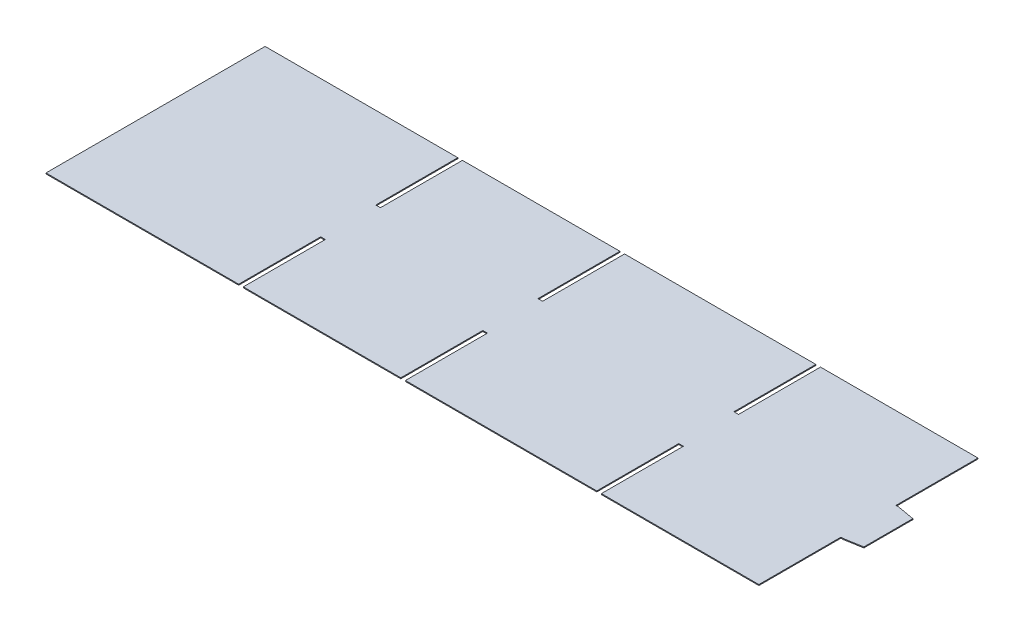
ISO-10303-21;
HEADER;
FILE_DESCRIPTION(('STEP AP214'),'2;1');
FILE_NAME('part.step','',(''),(''),'','','');
FILE_SCHEMA(('AUTOMOTIVE_DESIGN { 1 0 10303 214 1 1 1 1 }'));
ENDSEC;
DATA;
#1=APPLICATION_CONTEXT('core data for automotive mechanical design processes');
#2=APPLICATION_PROTOCOL_DEFINITION('international standard','automotive_design',2000,#1);
#3=PRODUCT_CONTEXT('',#1,'mechanical');
#4=PRODUCT('Part','Part','',(#3));
#5=PRODUCT_RELATED_PRODUCT_CATEGORY('part','',(#4));
#6=PRODUCT_DEFINITION_FORMATION('','',#4);
#7=PRODUCT_DEFINITION_CONTEXT('part definition',#1,'design');
#8=PRODUCT_DEFINITION('design','',#6,#7);
#9=PRODUCT_DEFINITION_SHAPE('','',#8);
#10=(LENGTH_UNIT() NAMED_UNIT(*) SI_UNIT(.MILLI.,.METRE.));
#11=(NAMED_UNIT(*) PLANE_ANGLE_UNIT() SI_UNIT($,.RADIAN.));
#12=(NAMED_UNIT(*) SI_UNIT($,.STERADIAN.) SOLID_ANGLE_UNIT());
#13=UNCERTAINTY_MEASURE_WITH_UNIT(LENGTH_MEASURE(1.E-05),#10,'distance_accuracy_value','');
#14=(GEOMETRIC_REPRESENTATION_CONTEXT(3) GLOBAL_UNCERTAINTY_ASSIGNED_CONTEXT((#13)) GLOBAL_UNIT_ASSIGNED_CONTEXT((#10,
#11,#12)) REPRESENTATION_CONTEXT('',''));
#15=CARTESIAN_POINT('',(0.,0.,0.));
#16=DIRECTION('',(0.,0.,1.));
#17=DIRECTION('',(1.,0.,0.));
#18=AXIS2_PLACEMENT_3D('',#15,#16,#17);
#19=CARTESIAN_POINT('',(0.,2.,177.));
#20=DIRECTION('',(0.,0.,-1.));
#21=DIRECTION('',(-1.,0.,0.));
#22=AXIS2_PLACEMENT_3D('',#19,#20,#21);
#23=PLANE('',#22);
#24=DIRECTION('',(1.,0.,0.));
#25=VECTOR('',#24,1.);
#26=CARTESIAN_POINT('',(0.,0.,177.));
#27=LINE('',#26,#25);
#28=CARTESIAN_POINT('',(0.,0.,177.));
#29=VERTEX_POINT('',#28);
#30=CARTESIAN_POINT('',(416.,0.,177.));
#31=VERTEX_POINT('',#30);
#32=EDGE_CURVE('E290',#29,#31,#27,.T.);
#33=ORIENTED_EDGE('',*,*,#32,.T.);
#34=DIRECTION('',(0.,-1.,0.));
#35=VECTOR('',#34,1.);
#36=CARTESIAN_POINT('',(416.,2.,177.));
#37=LINE('',#36,#35);
#38=CARTESIAN_POINT('',(416.,2.,177.));
#39=VERTEX_POINT('',#38);
#40=EDGE_CURVE('E42',#39,#31,#37,.T.);
#41=ORIENTED_EDGE('',*,*,#40,.F.);
#42=DIRECTION('',(1.,0.,0.));
#43=VECTOR('',#42,1.);
#44=CARTESIAN_POINT('',(0.,2.,177.));
#45=LINE('',#44,#43);
#46=CARTESIAN_POINT('',(0.,2.,177.));
#47=VERTEX_POINT('',#46);
#48=EDGE_CURVE('E172',#47,#39,#45,.T.);
#49=ORIENTED_EDGE('',*,*,#48,.F.);
#50=DIRECTION('',(0.,-1.,0.));
#51=VECTOR('',#50,1.);
#52=CARTESIAN_POINT('',(0.,2.,177.));
#53=LINE('',#52,#51);
#54=EDGE_CURVE('E11',#47,#29,#53,.T.);
#55=ORIENTED_EDGE('',*,*,#54,.T.);
#56=EDGE_LOOP('',(#33,#41,#49,#55));
#57=FACE_BOUND('',#56,.T.);
#58=ADVANCED_FACE('F34',(#57),#23,.F.);
#59=CARTESIAN_POINT('',(416.,2.,177.));
#60=DIRECTION('',(-1.,0.,0.));
#61=DIRECTION('',(0.,0.,1.));
#62=AXIS2_PLACEMENT_3D('',#59,#60,#61);
#63=PLANE('',#62);
#64=DIRECTION('',(0.,0.,-1.));
#65=VECTOR('',#64,1.);
#66=CARTESIAN_POINT('',(416.,0.,177.));
#67=LINE('',#66,#65);
#68=CARTESIAN_POINT('',(416.,0.,1.26124737069477E-13));
#69=VERTEX_POINT('',#68);
#70=EDGE_CURVE('E292',#31,#69,#67,.T.);
#71=ORIENTED_EDGE('',*,*,#70,.T.);
#72=DIRECTION('',(0.,-1.,0.));
#73=VECTOR('',#72,1.);
#74=CARTESIAN_POINT('',(416.,2.,1.26124737069477E-13));
#75=LINE('',#74,#73);
#76=CARTESIAN_POINT('',(416.,2.,1.26124737069477E-13));
#77=VERTEX_POINT('',#76);
#78=EDGE_CURVE('E439',#77,#69,#75,.T.);
#79=ORIENTED_EDGE('',*,*,#78,.F.);
#80=DIRECTION('',(0.,0.,-1.));
#81=VECTOR('',#80,1.);
#82=CARTESIAN_POINT('',(416.,2.,177.));
#83=LINE('',#82,#81);
#84=EDGE_CURVE('E447',#39,#77,#83,.T.);
#85=ORIENTED_EDGE('',*,*,#84,.F.);
#86=ORIENTED_EDGE('',*,*,#40,.T.);
#87=EDGE_LOOP('',(#71,#79,#85,#86));
#88=FACE_BOUND('',#87,.T.);
#89=ADVANCED_FACE('F445',(#88),#63,.F.);
#90=CARTESIAN_POINT('',(416.,2.,1.26124737069477E-13));
#91=DIRECTION('',(0.,0.,-1.));
#92=DIRECTION('',(-1.,0.,0.));
#93=AXIS2_PLACEMENT_3D('',#90,#91,#92);
#94=PLANE('',#93);
#95=DIRECTION('',(1.,0.,0.));
#96=VECTOR('',#95,1.);
#97=CARTESIAN_POINT('',(416.,0.,1.26124737069477E-13));
#98=LINE('',#97,#96);
#99=CARTESIAN_POINT('',(426.,0.,1.2490009027033E-13));
#100=VERTEX_POINT('',#99);
#101=EDGE_CURVE('E294',#69,#100,#98,.T.);
#102=ORIENTED_EDGE('',*,*,#101,.T.);
#103=DIRECTION('',(0.,-1.,0.));
#104=VECTOR('',#103,1.);
#105=CARTESIAN_POINT('',(426.,2.,1.2490009027033E-13));
#106=LINE('',#105,#104);
#107=CARTESIAN_POINT('',(426.,2.,1.2490009027033E-13));
#108=VERTEX_POINT('',#107);
#109=EDGE_CURVE('E436',#108,#100,#106,.T.);
#110=ORIENTED_EDGE('',*,*,#109,.F.);
#111=DIRECTION('',(1.,0.,0.));
#112=VECTOR('',#111,1.);
#113=CARTESIAN_POINT('',(416.,2.,1.26124737069477E-13));
#114=LINE('',#113,#112);
#115=EDGE_CURVE('E466',#77,#108,#114,.T.);
#116=ORIENTED_EDGE('',*,*,#115,.F.);
#117=ORIENTED_EDGE('',*,*,#78,.T.);
#118=EDGE_LOOP('',(#102,#110,#116,#117));
#119=FACE_BOUND('',#118,.T.);
#120=ADVANCED_FACE('F457',(#119),#94,.F.);
#121=CARTESIAN_POINT('',(426.,2.,1.2490009027033E-13));
#122=DIRECTION('',(1.,0.,0.));
#123=DIRECTION('',(0.,0.,-1.));
#124=AXIS2_PLACEMENT_3D('',#121,#122,#123);
#125=PLANE('',#124);
#126=DIRECTION('',(0.,0.,1.));
#127=VECTOR('',#126,1.);
#128=CARTESIAN_POINT('',(426.,0.,1.2490009027033E-13));
#129=LINE('',#128,#127);
#130=CARTESIAN_POINT('',(426.,0.,177.));
#131=VERTEX_POINT('',#130);
#132=EDGE_CURVE('E296',#100,#131,#129,.T.);
#133=ORIENTED_EDGE('',*,*,#132,.T.);
#134=DIRECTION('',(0.,-1.,0.));
#135=VECTOR('',#134,1.);
#136=CARTESIAN_POINT('',(426.,2.,177.));
#137=LINE('',#136,#135);
#138=CARTESIAN_POINT('',(426.,2.,177.));
#139=VERTEX_POINT('',#138);
#140=EDGE_CURVE('E433',#139,#131,#137,.T.);
#141=ORIENTED_EDGE('',*,*,#140,.F.);
#142=DIRECTION('',(0.,0.,1.));
#143=VECTOR('',#142,1.);
#144=CARTESIAN_POINT('',(426.,2.,1.2490009027033E-13));
#145=LINE('',#144,#143);
#146=EDGE_CURVE('E463',#108,#139,#145,.T.);
#147=ORIENTED_EDGE('',*,*,#146,.F.);
#148=ORIENTED_EDGE('',*,*,#109,.T.);
#149=EDGE_LOOP('',(#133,#141,#147,#148));
#150=FACE_BOUND('',#149,.T.);
#151=ADVANCED_FACE('F461',(#150),#125,.F.);
#152=CARTESIAN_POINT('',(426.,2.,177.));
#153=DIRECTION('',(0.,0.,-1.));
#154=DIRECTION('',(-1.,0.,0.));
#155=AXIS2_PLACEMENT_3D('',#152,#153,#154);
#156=PLANE('',#155);
#157=DIRECTION('',(1.,0.,0.));
#158=VECTOR('',#157,1.);
#159=CARTESIAN_POINT('',(426.,0.,177.));
#160=LINE('',#159,#158);
#161=CARTESIAN_POINT('',(766.,0.,177.));
#162=VERTEX_POINT('',#161);
#163=EDGE_CURVE('E298',#131,#162,#160,.T.);
#164=ORIENTED_EDGE('',*,*,#163,.T.);
#165=DIRECTION('',(0.,-1.,0.));
#166=VECTOR('',#165,1.);
#167=CARTESIAN_POINT('',(766.,2.,177.));
#168=LINE('',#167,#166);
#169=CARTESIAN_POINT('',(766.,2.,177.));
#170=VERTEX_POINT('',#169);
#171=EDGE_CURVE('E430',#170,#162,#168,.T.);
#172=ORIENTED_EDGE('',*,*,#171,.F.);
#173=DIRECTION('',(1.,0.,0.));
#174=VECTOR('',#173,1.);
#175=CARTESIAN_POINT('',(426.,2.,177.));
#176=LINE('',#175,#174);
#177=EDGE_CURVE('E465',#139,#170,#176,.T.);
#178=ORIENTED_EDGE('',*,*,#177,.F.);
#179=ORIENTED_EDGE('',*,*,#140,.T.);
#180=EDGE_LOOP('',(#164,#172,#178,#179));
#181=FACE_BOUND('',#180,.T.);
#182=ADVANCED_FACE('F552',(#181),#156,.F.);
#183=CARTESIAN_POINT('',(766.,2.,177.));
#184=DIRECTION('',(-1.,0.,0.));
#185=DIRECTION('',(0.,0.,1.));
#186=AXIS2_PLACEMENT_3D('',#183,#184,#185);
#187=PLANE('',#186);
#188=DIRECTION('',(0.,0.,-1.));
#189=VECTOR('',#188,1.);
#190=CARTESIAN_POINT('',(766.,0.,177.));
#191=LINE('',#190,#189);
#192=CARTESIAN_POINT('',(766.,0.,0.));
#193=VERTEX_POINT('',#192);
#194=EDGE_CURVE('E300',#162,#193,#191,.T.);
#195=ORIENTED_EDGE('',*,*,#194,.T.);
#196=DIRECTION('',(0.,-1.,0.));
#197=VECTOR('',#196,1.);
#198=CARTESIAN_POINT('',(766.,2.,0.));
#199=LINE('',#198,#197);
#200=CARTESIAN_POINT('',(766.,2.,0.));
#201=VERTEX_POINT('',#200);
#202=EDGE_CURVE('E427',#201,#193,#199,.T.);
#203=ORIENTED_EDGE('',*,*,#202,.F.);
#204=DIRECTION('',(0.,0.,-1.));
#205=VECTOR('',#204,1.);
#206=CARTESIAN_POINT('',(766.,2.,177.));
#207=LINE('',#206,#205);
#208=EDGE_CURVE('E468',#170,#201,#207,.T.);
#209=ORIENTED_EDGE('',*,*,#208,.F.);
#210=ORIENTED_EDGE('',*,*,#171,.T.);
#211=EDGE_LOOP('',(#195,#203,#209,#210));
#212=FACE_BOUND('',#211,.T.);
#213=ADVANCED_FACE('F555',(#212),#187,.F.);
#214=CARTESIAN_POINT('',(766.,2.,0.));
#215=DIRECTION('',(0.,0.,-1.));
#216=DIRECTION('',(-1.,0.,0.));
#217=AXIS2_PLACEMENT_3D('',#214,#215,#216);
#218=PLANE('',#217);
#219=DIRECTION('',(1.,0.,0.));
#220=VECTOR('',#219,1.);
#221=CARTESIAN_POINT('',(766.,0.,0.));
#222=LINE('',#221,#220);
#223=CARTESIAN_POINT('',(776.,0.,0.));
#224=VERTEX_POINT('',#223);
#225=EDGE_CURVE('E302',#193,#224,#222,.T.);
#226=ORIENTED_EDGE('',*,*,#225,.T.);
#227=DIRECTION('',(0.,-1.,0.));
#228=VECTOR('',#227,1.);
#229=CARTESIAN_POINT('',(776.,2.,0.));
#230=LINE('',#229,#228);
#231=CARTESIAN_POINT('',(776.,2.,0.));
#232=VERTEX_POINT('',#231);
#233=EDGE_CURVE('E424',#232,#224,#230,.T.);
#234=ORIENTED_EDGE('',*,*,#233,.F.);
#235=DIRECTION('',(1.,0.,0.));
#236=VECTOR('',#235,1.);
#237=CARTESIAN_POINT('',(766.,2.,0.));
#238=LINE('',#237,#236);
#239=EDGE_CURVE('E474',#201,#232,#238,.T.);
#240=ORIENTED_EDGE('',*,*,#239,.F.);
#241=ORIENTED_EDGE('',*,*,#202,.T.);
#242=EDGE_LOOP('',(#226,#234,#240,#241));
#243=FACE_BOUND('',#242,.T.);
#244=ADVANCED_FACE('F559',(#243),#218,.F.);
#245=CARTESIAN_POINT('',(776.,2.,0.));
#246=DIRECTION('',(1.,0.,0.));
#247=DIRECTION('',(0.,0.,-1.));
#248=AXIS2_PLACEMENT_3D('',#245,#246,#247);
#249=PLANE('',#248);
#250=DIRECTION('',(0.,0.,1.));
#251=VECTOR('',#250,1.);
#252=CARTESIAN_POINT('',(776.,0.,0.));
#253=LINE('',#252,#251);
#254=CARTESIAN_POINT('',(776.,0.,177.));
#255=VERTEX_POINT('',#254);
#256=EDGE_CURVE('E304',#224,#255,#253,.T.);
#257=ORIENTED_EDGE('',*,*,#256,.T.);
#258=DIRECTION('',(0.,-1.,0.));
#259=VECTOR('',#258,1.);
#260=CARTESIAN_POINT('',(776.,2.,177.));
#261=LINE('',#260,#259);
#262=CARTESIAN_POINT('',(776.,2.,177.));
#263=VERTEX_POINT('',#262);
#264=EDGE_CURVE('E421',#263,#255,#261,.T.);
#265=ORIENTED_EDGE('',*,*,#264,.F.);
#266=DIRECTION('',(0.,0.,1.));
#267=VECTOR('',#266,1.);
#268=CARTESIAN_POINT('',(776.,2.,0.));
#269=LINE('',#268,#267);
#270=EDGE_CURVE('E476',#232,#263,#269,.T.);
#271=ORIENTED_EDGE('',*,*,#270,.F.);
#272=ORIENTED_EDGE('',*,*,#233,.T.);
#273=EDGE_LOOP('',(#257,#265,#271,#272));
#274=FACE_BOUND('',#273,.T.);
#275=ADVANCED_FACE('F563',(#274),#249,.F.);
#276=CARTESIAN_POINT('',(776.,2.,177.));
#277=DIRECTION('',(0.,0.,-1.));
#278=DIRECTION('',(-1.,0.,0.));
#279=AXIS2_PLACEMENT_3D('',#276,#277,#278);
#280=PLANE('',#279);
#281=DIRECTION('',(1.,0.,0.));
#282=VECTOR('',#281,1.);
#283=CARTESIAN_POINT('',(776.,0.,177.));
#284=LINE('',#283,#282);
#285=CARTESIAN_POINT('',(1189.,0.,177.));
#286=VERTEX_POINT('',#285);
#287=EDGE_CURVE('E306',#255,#286,#284,.T.);
#288=ORIENTED_EDGE('',*,*,#287,.T.);
#289=DIRECTION('',(0.,-1.,0.));
#290=VECTOR('',#289,1.);
#291=CARTESIAN_POINT('',(1189.,2.,177.));
#292=LINE('',#291,#290);
#293=CARTESIAN_POINT('',(1189.,2.,177.));
#294=VERTEX_POINT('',#293);
#295=EDGE_CURVE('E418',#294,#286,#292,.T.);
#296=ORIENTED_EDGE('',*,*,#295,.F.);
#297=DIRECTION('',(1.,0.,0.));
#298=VECTOR('',#297,1.);
#299=CARTESIAN_POINT('',(776.,2.,177.));
#300=LINE('',#299,#298);
#301=EDGE_CURVE('E478',#263,#294,#300,.T.);
#302=ORIENTED_EDGE('',*,*,#301,.F.);
#303=ORIENTED_EDGE('',*,*,#264,.T.);
#304=EDGE_LOOP('',(#288,#296,#302,#303));
#305=FACE_BOUND('',#304,.T.);
#306=ADVANCED_FACE('F567',(#305),#280,.F.);
#307=CARTESIAN_POINT('',(1189.,2.,177.));
#308=DIRECTION('',(-1.,0.,0.));
#309=DIRECTION('',(0.,0.,1.));
#310=AXIS2_PLACEMENT_3D('',#307,#308,#309);
#311=PLANE('',#310);
#312=DIRECTION('',(0.,0.,-1.));
#313=VECTOR('',#312,1.);
#314=CARTESIAN_POINT('',(1189.,0.,177.));
#315=LINE('',#314,#313);
#316=CARTESIAN_POINT('',(1189.,0.,0.));
#317=VERTEX_POINT('',#316);
#318=EDGE_CURVE('E308',#286,#317,#315,.T.);
#319=ORIENTED_EDGE('',*,*,#318,.T.);
#320=DIRECTION('',(0.,-1.,0.));
#321=VECTOR('',#320,1.);
#322=CARTESIAN_POINT('',(1189.,2.,0.));
#323=LINE('',#322,#321);
#324=CARTESIAN_POINT('',(1189.,2.,0.));
#325=VERTEX_POINT('',#324);
#326=EDGE_CURVE('E415',#325,#317,#323,.T.);
#327=ORIENTED_EDGE('',*,*,#326,.F.);
#328=DIRECTION('',(0.,0.,-1.));
#329=VECTOR('',#328,1.);
#330=CARTESIAN_POINT('',(1189.,2.,177.));
#331=LINE('',#330,#329);
#332=EDGE_CURVE('E480',#294,#325,#331,.T.);
#333=ORIENTED_EDGE('',*,*,#332,.F.);
#334=ORIENTED_EDGE('',*,*,#295,.T.);
#335=EDGE_LOOP('',(#319,#327,#333,#334));
#336=FACE_BOUND('',#335,.T.);
#337=ADVANCED_FACE('F571',(#336),#311,.F.);
#338=CARTESIAN_POINT('',(1189.,2.,0.));
#339=DIRECTION('',(0.,0.,-1.));
#340=DIRECTION('',(-1.,0.,0.));
#341=AXIS2_PLACEMENT_3D('',#338,#339,#340);
#342=PLANE('',#341);
#343=DIRECTION('',(1.,0.,0.));
#344=VECTOR('',#343,1.);
#345=CARTESIAN_POINT('',(1189.,0.,0.));
#346=LINE('',#345,#344);
#347=CARTESIAN_POINT('',(1199.,0.,0.));
#348=VERTEX_POINT('',#347);
#349=EDGE_CURVE('E310',#317,#348,#346,.T.);
#350=ORIENTED_EDGE('',*,*,#349,.T.);
#351=DIRECTION('',(0.,-1.,0.));
#352=VECTOR('',#351,1.);
#353=CARTESIAN_POINT('',(1199.,2.,0.));
#354=LINE('',#353,#352);
#355=CARTESIAN_POINT('',(1199.,2.,0.));
#356=VERTEX_POINT('',#355);
#357=EDGE_CURVE('E412',#356,#348,#354,.T.);
#358=ORIENTED_EDGE('',*,*,#357,.F.);
#359=DIRECTION('',(1.,0.,0.));
#360=VECTOR('',#359,1.);
#361=CARTESIAN_POINT('',(1189.,2.,0.));
#362=LINE('',#361,#360);
#363=EDGE_CURVE('E482',#325,#356,#362,.T.);
#364=ORIENTED_EDGE('',*,*,#363,.F.);
#365=ORIENTED_EDGE('',*,*,#326,.T.);
#366=EDGE_LOOP('',(#350,#358,#364,#365));
#367=FACE_BOUND('',#366,.T.);
#368=ADVANCED_FACE('F575',(#367),#342,.F.);
#369=CARTESIAN_POINT('',(1199.,2.,0.));
#370=DIRECTION('',(1.,0.,0.));
#371=DIRECTION('',(0.,0.,-1.));
#372=AXIS2_PLACEMENT_3D('',#369,#370,#371);
#373=PLANE('',#372);
#374=DIRECTION('',(0.,0.,1.));
#375=VECTOR('',#374,1.);
#376=CARTESIAN_POINT('',(1199.,0.,0.));
#377=LINE('',#376,#375);
#378=CARTESIAN_POINT('',(1199.,0.,177.));
#379=VERTEX_POINT('',#378);
#380=EDGE_CURVE('E312',#348,#379,#377,.T.);
#381=ORIENTED_EDGE('',*,*,#380,.T.);
#382=DIRECTION('',(0.,-1.,0.));
#383=VECTOR('',#382,1.);
#384=CARTESIAN_POINT('',(1199.,2.,177.));
#385=LINE('',#384,#383);
#386=CARTESIAN_POINT('',(1199.,2.,177.));
#387=VERTEX_POINT('',#386);
#388=EDGE_CURVE('E409',#387,#379,#385,.T.);
#389=ORIENTED_EDGE('',*,*,#388,.F.);
#390=DIRECTION('',(0.,0.,1.));
#391=VECTOR('',#390,1.);
#392=CARTESIAN_POINT('',(1199.,2.,0.));
#393=LINE('',#392,#391);
#394=EDGE_CURVE('E484',#356,#387,#393,.T.);
#395=ORIENTED_EDGE('',*,*,#394,.F.);
#396=ORIENTED_EDGE('',*,*,#357,.T.);
#397=EDGE_LOOP('',(#381,#389,#395,#396));
#398=FACE_BOUND('',#397,.T.);
#399=ADVANCED_FACE('F579',(#398),#373,.F.);
#400=CARTESIAN_POINT('',(1199.,2.,177.));
#401=DIRECTION('',(0.,0.,-1.));
#402=DIRECTION('',(-1.,0.,0.));
#403=AXIS2_PLACEMENT_3D('',#400,#401,#402);
#404=PLANE('',#403);
#405=DIRECTION('',(1.,0.,0.));
#406=VECTOR('',#405,1.);
#407=CARTESIAN_POINT('',(1199.,0.,177.));
#408=LINE('',#407,#406);
#409=CARTESIAN_POINT('',(1539.,0.,177.));
#410=VERTEX_POINT('',#409);
#411=EDGE_CURVE('E314',#379,#410,#408,.T.);
#412=ORIENTED_EDGE('',*,*,#411,.T.);
#413=DIRECTION('',(0.,-1.,0.));
#414=VECTOR('',#413,1.);
#415=CARTESIAN_POINT('',(1539.,2.,177.));
#416=LINE('',#415,#414);
#417=CARTESIAN_POINT('',(1539.,2.,177.));
#418=VERTEX_POINT('',#417);
#419=EDGE_CURVE('E406',#418,#410,#416,.T.);
#420=ORIENTED_EDGE('',*,*,#419,.F.);
#421=DIRECTION('',(1.,0.,0.));
#422=VECTOR('',#421,1.);
#423=CARTESIAN_POINT('',(1199.,2.,177.));
#424=LINE('',#423,#422);
#425=EDGE_CURVE('E486',#387,#418,#424,.T.);
#426=ORIENTED_EDGE('',*,*,#425,.F.);
#427=ORIENTED_EDGE('',*,*,#388,.T.);
#428=EDGE_LOOP('',(#412,#420,#426,#427));
#429=FACE_BOUND('',#428,.T.);
#430=ADVANCED_FACE('F583',(#429),#404,.F.);
#431=CARTESIAN_POINT('',(1539.,2.,-1.52655665885959E-13));
#432=DIRECTION('',(-1.,0.,0.));
#433=DIRECTION('',(0.,0.,1.));
#434=AXIS2_PLACEMENT_3D('',#431,#432,#433);
#435=PLANE('',#434);
#436=DIRECTION('',(0.,0.,-1.));
#437=VECTOR('',#436,1.);
#438=CARTESIAN_POINT('',(1539.,0.,-1.52655665885959E-13));
#439=LINE('',#438,#437);
#440=CARTESIAN_POINT('',(1539.,0.,-1.52655665885959E-13));
#441=VERTEX_POINT('',#440);
#442=EDGE_CURVE('E316',#410,#441,#439,.T.);
#443=ORIENTED_EDGE('',*,*,#442,.T.);
#444=DIRECTION('',(0.,-1.,0.));
#445=VECTOR('',#444,1.);
#446=CARTESIAN_POINT('',(1539.,2.,-1.52655665885959E-13));
#447=LINE('',#446,#445);
#448=CARTESIAN_POINT('',(1539.,2.,-1.52655665885959E-13));
#449=VERTEX_POINT('',#448);
#450=EDGE_CURVE('E403',#449,#441,#447,.T.);
#451=ORIENTED_EDGE('',*,*,#450,.F.);
#452=DIRECTION('',(0.,0.,-1.));
#453=VECTOR('',#452,1.);
#454=CARTESIAN_POINT('',(1539.,2.,-1.52655665885959E-13));
#455=LINE('',#454,#453);
#456=EDGE_CURVE('E488',#418,#449,#455,.T.);
#457=ORIENTED_EDGE('',*,*,#456,.F.);
#458=ORIENTED_EDGE('',*,*,#419,.T.);
#459=EDGE_LOOP('',(#443,#451,#457,#458));
#460=FACE_BOUND('',#459,.T.);
#461=ADVANCED_FACE('F587',(#460),#435,.F.);
#462=CARTESIAN_POINT('',(1544.,2.,0.));
#463=DIRECTION('',(0.,0.,-1.));
#464=DIRECTION('',(-1.,0.,0.));
#465=AXIS2_PLACEMENT_3D('',#462,#463,#464);
#466=PLANE('',#465);
#467=DIRECTION('',(1.,0.,0.));
#468=VECTOR('',#467,1.);
#469=CARTESIAN_POINT('',(1544.,0.,0.));
#470=LINE('',#469,#468);
#471=CARTESIAN_POINT('',(1544.,0.,0.));
#472=VERTEX_POINT('',#471);
#473=EDGE_CURVE('E318',#441,#472,#470,.T.);
#474=ORIENTED_EDGE('',*,*,#473,.T.);
#475=DIRECTION('',(0.,-1.,0.));
#476=VECTOR('',#475,1.);
#477=CARTESIAN_POINT('',(1544.,2.,0.));
#478=LINE('',#477,#476);
#479=CARTESIAN_POINT('',(1544.,2.,0.));
#480=VERTEX_POINT('',#479);
#481=EDGE_CURVE('E400',#480,#472,#478,.T.);
#482=ORIENTED_EDGE('',*,*,#481,.F.);
#483=DIRECTION('',(1.,0.,0.));
#484=VECTOR('',#483,1.);
#485=CARTESIAN_POINT('',(1544.,2.,0.));
#486=LINE('',#485,#484);
#487=EDGE_CURVE('E490',#449,#480,#486,.T.);
#488=ORIENTED_EDGE('',*,*,#487,.F.);
#489=ORIENTED_EDGE('',*,*,#450,.T.);
#490=EDGE_LOOP('',(#474,#482,#488,#489));
#491=FACE_BOUND('',#490,.T.);
#492=ADVANCED_FACE('F591',(#491),#466,.F.);
#493=CARTESIAN_POINT('',(1544.,2.,0.));
#494=DIRECTION('',(-0.173648177666921,0.,-0.98480775301221));
#495=DIRECTION('',(-0.98480775301221,0.,0.173648177666921));
#496=AXIS2_PLACEMENT_3D('',#493,#494,#495);
#497=PLANE('',#496);
#498=DIRECTION('',(0.98480775301221,0.,-0.173648177666921));
#499=VECTOR('',#498,1.);
#500=CARTESIAN_POINT('',(1544.,0.,0.));
#501=LINE('',#500,#499);
#502=CARTESIAN_POINT('',(1582.,0.,-6.70042526692131));
#503=VERTEX_POINT('',#502);
#504=EDGE_CURVE('E320',#472,#503,#501,.T.);
#505=ORIENTED_EDGE('',*,*,#504,.T.);
#506=DIRECTION('',(0.,-1.,0.));
#507=VECTOR('',#506,1.);
#508=CARTESIAN_POINT('',(1582.,2.,-6.70042526692131));
#509=LINE('',#508,#507);
#510=CARTESIAN_POINT('',(1582.,2.,-6.70042526692131));
#511=VERTEX_POINT('',#510);
#512=EDGE_CURVE('E397',#511,#503,#509,.T.);
#513=ORIENTED_EDGE('',*,*,#512,.F.);
#514=DIRECTION('',(0.98480775301221,0.,-0.173648177666921));
#515=VECTOR('',#514,1.);
#516=CARTESIAN_POINT('',(1544.,2.,0.));
#517=LINE('',#516,#515);
#518=EDGE_CURVE('E492',#480,#511,#517,.T.);
#519=ORIENTED_EDGE('',*,*,#518,.F.);
#520=ORIENTED_EDGE('',*,*,#481,.T.);
#521=EDGE_LOOP('',(#505,#513,#519,#520));
#522=FACE_BOUND('',#521,.T.);
#523=ADVANCED_FACE('F595',(#522),#497,.F.);
#524=CARTESIAN_POINT('',(1582.,2.,-112.299574733079));
#525=DIRECTION('',(-1.,0.,0.));
#526=DIRECTION('',(0.,0.,1.));
#527=AXIS2_PLACEMENT_3D('',#524,#525,#526);
#528=PLANE('',#527);
#529=DIRECTION('',(0.,0.,-1.));
#530=VECTOR('',#529,1.);
#531=CARTESIAN_POINT('',(1582.,0.,-112.299574733079));
#532=LINE('',#531,#530);
#533=CARTESIAN_POINT('',(1582.,0.,-112.299574733079));
#534=VERTEX_POINT('',#533);
#535=EDGE_CURVE('E322',#503,#534,#532,.T.);
#536=ORIENTED_EDGE('',*,*,#535,.T.);
#537=DIRECTION('',(0.,-1.,0.));
#538=VECTOR('',#537,1.);
#539=CARTESIAN_POINT('',(1582.,2.,-112.299574733079));
#540=LINE('',#539,#538);
#541=CARTESIAN_POINT('',(1582.,2.,-112.299574733079));
#542=VERTEX_POINT('',#541);
#543=EDGE_CURVE('E394',#542,#534,#540,.T.);
#544=ORIENTED_EDGE('',*,*,#543,.F.);
#545=DIRECTION('',(0.,0.,-1.));
#546=VECTOR('',#545,1.);
#547=CARTESIAN_POINT('',(1582.,2.,-112.299574733079));
#548=LINE('',#547,#546);
#549=EDGE_CURVE('E494',#511,#542,#548,.T.);
#550=ORIENTED_EDGE('',*,*,#549,.F.);
#551=ORIENTED_EDGE('',*,*,#512,.T.);
#552=EDGE_LOOP('',(#536,#544,#550,#551));
#553=FACE_BOUND('',#552,.T.);
#554=ADVANCED_FACE('F599',(#553),#528,.F.);
#555=CARTESIAN_POINT('',(1544.,2.,-119.));
#556=DIRECTION('',(-0.173648177666921,0.,0.98480775301221));
#557=DIRECTION('',(0.98480775301221,0.,0.173648177666921));
#558=AXIS2_PLACEMENT_3D('',#555,#556,#557);
#559=PLANE('',#558);
#560=DIRECTION('',(-0.98480775301221,0.,-0.173648177666921));
#561=VECTOR('',#560,1.);
#562=CARTESIAN_POINT('',(1544.,0.,-119.));
#563=LINE('',#562,#561);
#564=CARTESIAN_POINT('',(1544.,0.,-119.));
#565=VERTEX_POINT('',#564);
#566=EDGE_CURVE('E324',#534,#565,#563,.T.);
#567=ORIENTED_EDGE('',*,*,#566,.T.);
#568=DIRECTION('',(0.,-1.,0.));
#569=VECTOR('',#568,1.);
#570=CARTESIAN_POINT('',(1544.,2.,-119.));
#571=LINE('',#570,#569);
#572=CARTESIAN_POINT('',(1544.,2.,-119.));
#573=VERTEX_POINT('',#572);
#574=EDGE_CURVE('E391',#573,#565,#571,.T.);
#575=ORIENTED_EDGE('',*,*,#574,.F.);
#576=DIRECTION('',(-0.98480775301221,0.,-0.173648177666921));
#577=VECTOR('',#576,1.);
#578=CARTESIAN_POINT('',(1544.,2.,-119.));
#579=LINE('',#578,#577);
#580=EDGE_CURVE('E496',#542,#573,#579,.T.);
#581=ORIENTED_EDGE('',*,*,#580,.F.);
#582=ORIENTED_EDGE('',*,*,#543,.T.);
#583=EDGE_LOOP('',(#567,#575,#581,#582));
#584=FACE_BOUND('',#583,.T.);
#585=ADVANCED_FACE('F603',(#584),#559,.F.);
#586=CARTESIAN_POINT('',(1544.,2.,-119.));
#587=DIRECTION('',(0.,0.,1.));
#588=DIRECTION('',(1.,0.,0.));
#589=AXIS2_PLACEMENT_3D('',#586,#587,#588);
#590=PLANE('',#589);
#591=DIRECTION('',(-1.,0.,0.));
#592=VECTOR('',#591,1.);
#593=CARTESIAN_POINT('',(1544.,0.,-119.));
#594=LINE('',#593,#592);
#595=CARTESIAN_POINT('',(1539.,0.,-119.));
#596=VERTEX_POINT('',#595);
#597=EDGE_CURVE('E326',#565,#596,#594,.T.);
#598=ORIENTED_EDGE('',*,*,#597,.T.);
#599=DIRECTION('',(0.,-1.,0.));
#600=VECTOR('',#599,1.);
#601=CARTESIAN_POINT('',(1539.,2.,-119.));
#602=LINE('',#601,#600);
#603=CARTESIAN_POINT('',(1539.,2.,-119.));
#604=VERTEX_POINT('',#603);
#605=EDGE_CURVE('E388',#604,#596,#602,.T.);
#606=ORIENTED_EDGE('',*,*,#605,.F.);
#607=DIRECTION('',(-1.,0.,0.));
#608=VECTOR('',#607,1.);
#609=CARTESIAN_POINT('',(1544.,2.,-119.));
#610=LINE('',#609,#608);
#611=EDGE_CURVE('E498',#573,#604,#610,.T.);
#612=ORIENTED_EDGE('',*,*,#611,.F.);
#613=ORIENTED_EDGE('',*,*,#574,.T.);
#614=EDGE_LOOP('',(#598,#606,#612,#613));
#615=FACE_BOUND('',#614,.T.);
#616=ADVANCED_FACE('F607',(#615),#590,.F.);
#617=CARTESIAN_POINT('',(1539.,2.,-296.));
#618=DIRECTION('',(-1.,0.,0.));
#619=DIRECTION('',(0.,0.,1.));
#620=AXIS2_PLACEMENT_3D('',#617,#618,#619);
#621=PLANE('',#620);
#622=DIRECTION('',(0.,0.,-1.));
#623=VECTOR('',#622,1.);
#624=CARTESIAN_POINT('',(1539.,0.,-296.));
#625=LINE('',#624,#623);
#626=CARTESIAN_POINT('',(1539.,0.,-296.));
#627=VERTEX_POINT('',#626);
#628=EDGE_CURVE('E328',#596,#627,#625,.T.);
#629=ORIENTED_EDGE('',*,*,#628,.T.);
#630=DIRECTION('',(0.,-1.,0.));
#631=VECTOR('',#630,1.);
#632=CARTESIAN_POINT('',(1539.,2.,-296.));
#633=LINE('',#632,#631);
#634=CARTESIAN_POINT('',(1539.,2.,-296.));
#635=VERTEX_POINT('',#634);
#636=EDGE_CURVE('E385',#635,#627,#633,.T.);
#637=ORIENTED_EDGE('',*,*,#636,.F.);
#638=DIRECTION('',(0.,0.,-1.));
#639=VECTOR('',#638,1.);
#640=CARTESIAN_POINT('',(1539.,2.,-296.));
#641=LINE('',#640,#639);
#642=EDGE_CURVE('E500',#604,#635,#641,.T.);
#643=ORIENTED_EDGE('',*,*,#642,.F.);
#644=ORIENTED_EDGE('',*,*,#605,.T.);
#645=EDGE_LOOP('',(#629,#637,#643,#644));
#646=FACE_BOUND('',#645,.T.);
#647=ADVANCED_FACE('F611',(#646),#621,.F.);
#648=CARTESIAN_POINT('',(1199.,2.,-296.));
#649=DIRECTION('',(0.,0.,1.));
#650=DIRECTION('',(1.,0.,0.));
#651=AXIS2_PLACEMENT_3D('',#648,#649,#650);
#652=PLANE('',#651);
#653=DIRECTION('',(-1.,0.,0.));
#654=VECTOR('',#653,1.);
#655=CARTESIAN_POINT('',(1199.,0.,-296.));
#656=LINE('',#655,#654);
#657=CARTESIAN_POINT('',(1199.,0.,-296.));
#658=VERTEX_POINT('',#657);
#659=EDGE_CURVE('E330',#627,#658,#656,.T.);
#660=ORIENTED_EDGE('',*,*,#659,.T.);
#661=DIRECTION('',(0.,-1.,0.));
#662=VECTOR('',#661,1.);
#663=CARTESIAN_POINT('',(1199.,2.,-296.));
#664=LINE('',#663,#662);
#665=CARTESIAN_POINT('',(1199.,2.,-296.));
#666=VERTEX_POINT('',#665);
#667=EDGE_CURVE('E382',#666,#658,#664,.T.);
#668=ORIENTED_EDGE('',*,*,#667,.F.);
#669=DIRECTION('',(-1.,0.,0.));
#670=VECTOR('',#669,1.);
#671=CARTESIAN_POINT('',(1199.,2.,-296.));
#672=LINE('',#671,#670);
#673=EDGE_CURVE('E502',#635,#666,#672,.T.);
#674=ORIENTED_EDGE('',*,*,#673,.F.);
#675=ORIENTED_EDGE('',*,*,#636,.T.);
#676=EDGE_LOOP('',(#660,#668,#674,#675));
#677=FACE_BOUND('',#676,.T.);
#678=ADVANCED_FACE('F615',(#677),#652,.F.);
#679=CARTESIAN_POINT('',(1199.,2.,-119.));
#680=DIRECTION('',(1.,0.,0.));
#681=DIRECTION('',(0.,0.,-1.));
#682=AXIS2_PLACEMENT_3D('',#679,#680,#681);
#683=PLANE('',#682);
#684=DIRECTION('',(0.,0.,1.));
#685=VECTOR('',#684,1.);
#686=CARTESIAN_POINT('',(1199.,0.,-119.));
#687=LINE('',#686,#685);
#688=CARTESIAN_POINT('',(1199.,0.,-119.));
#689=VERTEX_POINT('',#688);
#690=EDGE_CURVE('E332',#658,#689,#687,.T.);
#691=ORIENTED_EDGE('',*,*,#690,.T.);
#692=DIRECTION('',(0.,-1.,0.));
#693=VECTOR('',#692,1.);
#694=CARTESIAN_POINT('',(1199.,2.,-119.));
#695=LINE('',#694,#693);
#696=CARTESIAN_POINT('',(1199.,2.,-119.));
#697=VERTEX_POINT('',#696);
#698=EDGE_CURVE('E379',#697,#689,#695,.T.);
#699=ORIENTED_EDGE('',*,*,#698,.F.);
#700=DIRECTION('',(0.,0.,1.));
#701=VECTOR('',#700,1.);
#702=CARTESIAN_POINT('',(1199.,2.,-119.));
#703=LINE('',#702,#701);
#704=EDGE_CURVE('E504',#666,#697,#703,.T.);
#705=ORIENTED_EDGE('',*,*,#704,.F.);
#706=ORIENTED_EDGE('',*,*,#667,.T.);
#707=EDGE_LOOP('',(#691,#699,#705,#706));
#708=FACE_BOUND('',#707,.T.);
#709=ADVANCED_FACE('F619',(#708),#683,.F.);
#710=CARTESIAN_POINT('',(1189.,2.,-119.));
#711=DIRECTION('',(0.,0.,1.));
#712=DIRECTION('',(1.,0.,0.));
#713=AXIS2_PLACEMENT_3D('',#710,#711,#712);
#714=PLANE('',#713);
#715=DIRECTION('',(-1.,0.,0.));
#716=VECTOR('',#715,1.);
#717=CARTESIAN_POINT('',(1189.,0.,-119.));
#718=LINE('',#717,#716);
#719=CARTESIAN_POINT('',(1189.,0.,-119.));
#720=VERTEX_POINT('',#719);
#721=EDGE_CURVE('E334',#689,#720,#718,.T.);
#722=ORIENTED_EDGE('',*,*,#721,.T.);
#723=DIRECTION('',(0.,-1.,0.));
#724=VECTOR('',#723,1.);
#725=CARTESIAN_POINT('',(1189.,2.,-119.));
#726=LINE('',#725,#724);
#727=CARTESIAN_POINT('',(1189.,2.,-119.));
#728=VERTEX_POINT('',#727);
#729=EDGE_CURVE('E376',#728,#720,#726,.T.);
#730=ORIENTED_EDGE('',*,*,#729,.F.);
#731=DIRECTION('',(-1.,0.,0.));
#732=VECTOR('',#731,1.);
#733=CARTESIAN_POINT('',(1189.,2.,-119.));
#734=LINE('',#733,#732);
#735=EDGE_CURVE('E506',#697,#728,#734,.T.);
#736=ORIENTED_EDGE('',*,*,#735,.F.);
#737=ORIENTED_EDGE('',*,*,#698,.T.);
#738=EDGE_LOOP('',(#722,#730,#736,#737));
#739=FACE_BOUND('',#738,.T.);
#740=ADVANCED_FACE('F623',(#739),#714,.F.);
#741=CARTESIAN_POINT('',(1189.,2.,-296.));
#742=DIRECTION('',(-1.,0.,0.));
#743=DIRECTION('',(0.,0.,1.));
#744=AXIS2_PLACEMENT_3D('',#741,#742,#743);
#745=PLANE('',#744);
#746=DIRECTION('',(0.,0.,-1.));
#747=VECTOR('',#746,1.);
#748=CARTESIAN_POINT('',(1189.,0.,-296.));
#749=LINE('',#748,#747);
#750=CARTESIAN_POINT('',(1189.,0.,-296.));
#751=VERTEX_POINT('',#750);
#752=EDGE_CURVE('E336',#720,#751,#749,.T.);
#753=ORIENTED_EDGE('',*,*,#752,.T.);
#754=DIRECTION('',(0.,-1.,0.));
#755=VECTOR('',#754,1.);
#756=CARTESIAN_POINT('',(1189.,2.,-296.));
#757=LINE('',#756,#755);
#758=CARTESIAN_POINT('',(1189.,2.,-296.));
#759=VERTEX_POINT('',#758);
#760=EDGE_CURVE('E373',#759,#751,#757,.T.);
#761=ORIENTED_EDGE('',*,*,#760,.F.);
#762=DIRECTION('',(0.,0.,-1.));
#763=VECTOR('',#762,1.);
#764=CARTESIAN_POINT('',(1189.,2.,-296.));
#765=LINE('',#764,#763);
#766=EDGE_CURVE('E508',#728,#759,#765,.T.);
#767=ORIENTED_EDGE('',*,*,#766,.F.);
#768=ORIENTED_EDGE('',*,*,#729,.T.);
#769=EDGE_LOOP('',(#753,#761,#767,#768));
#770=FACE_BOUND('',#769,.T.);
#771=ADVANCED_FACE('F627',(#770),#745,.F.);
#772=CARTESIAN_POINT('',(776.,2.,-296.));
#773=DIRECTION('',(0.,0.,1.));
#774=DIRECTION('',(1.,0.,0.));
#775=AXIS2_PLACEMENT_3D('',#772,#773,#774);
#776=PLANE('',#775);
#777=DIRECTION('',(-1.,0.,0.));
#778=VECTOR('',#777,1.);
#779=CARTESIAN_POINT('',(776.,0.,-296.));
#780=LINE('',#779,#778);
#781=CARTESIAN_POINT('',(776.,0.,-296.));
#782=VERTEX_POINT('',#781);
#783=EDGE_CURVE('E338',#751,#782,#780,.T.);
#784=ORIENTED_EDGE('',*,*,#783,.T.);
#785=DIRECTION('',(0.,-1.,0.));
#786=VECTOR('',#785,1.);
#787=CARTESIAN_POINT('',(776.,2.,-296.));
#788=LINE('',#787,#786);
#789=CARTESIAN_POINT('',(776.,2.,-296.));
#790=VERTEX_POINT('',#789);
#791=EDGE_CURVE('E370',#790,#782,#788,.T.);
#792=ORIENTED_EDGE('',*,*,#791,.F.);
#793=DIRECTION('',(-1.,0.,0.));
#794=VECTOR('',#793,1.);
#795=CARTESIAN_POINT('',(776.,2.,-296.));
#796=LINE('',#795,#794);
#797=EDGE_CURVE('E510',#759,#790,#796,.T.);
#798=ORIENTED_EDGE('',*,*,#797,.F.);
#799=ORIENTED_EDGE('',*,*,#760,.T.);
#800=EDGE_LOOP('',(#784,#792,#798,#799));
#801=FACE_BOUND('',#800,.T.);
#802=ADVANCED_FACE('F631',(#801),#776,.F.);
#803=CARTESIAN_POINT('',(776.,2.,-119.));
#804=DIRECTION('',(1.,0.,0.));
#805=DIRECTION('',(0.,0.,-1.));
#806=AXIS2_PLACEMENT_3D('',#803,#804,#805);
#807=PLANE('',#806);
#808=DIRECTION('',(0.,0.,1.));
#809=VECTOR('',#808,1.);
#810=CARTESIAN_POINT('',(776.,0.,-119.));
#811=LINE('',#810,#809);
#812=CARTESIAN_POINT('',(776.,0.,-119.));
#813=VERTEX_POINT('',#812);
#814=EDGE_CURVE('E340',#782,#813,#811,.T.);
#815=ORIENTED_EDGE('',*,*,#814,.T.);
#816=DIRECTION('',(0.,-1.,0.));
#817=VECTOR('',#816,1.);
#818=CARTESIAN_POINT('',(776.,2.,-119.));
#819=LINE('',#818,#817);
#820=CARTESIAN_POINT('',(776.,2.,-119.));
#821=VERTEX_POINT('',#820);
#822=EDGE_CURVE('E367',#821,#813,#819,.T.);
#823=ORIENTED_EDGE('',*,*,#822,.F.);
#824=DIRECTION('',(0.,0.,1.));
#825=VECTOR('',#824,1.);
#826=CARTESIAN_POINT('',(776.,2.,-119.));
#827=LINE('',#826,#825);
#828=EDGE_CURVE('E512',#790,#821,#827,.T.);
#829=ORIENTED_EDGE('',*,*,#828,.F.);
#830=ORIENTED_EDGE('',*,*,#791,.T.);
#831=EDGE_LOOP('',(#815,#823,#829,#830));
#832=FACE_BOUND('',#831,.T.);
#833=ADVANCED_FACE('F635',(#832),#807,.F.);
#834=CARTESIAN_POINT('',(766.,2.,-119.));
#835=DIRECTION('',(0.,0.,1.));
#836=DIRECTION('',(1.,0.,0.));
#837=AXIS2_PLACEMENT_3D('',#834,#835,#836);
#838=PLANE('',#837);
#839=DIRECTION('',(-1.,0.,0.));
#840=VECTOR('',#839,1.);
#841=CARTESIAN_POINT('',(766.,0.,-119.));
#842=LINE('',#841,#840);
#843=CARTESIAN_POINT('',(766.,0.,-119.));
#844=VERTEX_POINT('',#843);
#845=EDGE_CURVE('E342',#813,#844,#842,.T.);
#846=ORIENTED_EDGE('',*,*,#845,.T.);
#847=DIRECTION('',(0.,-1.,0.));
#848=VECTOR('',#847,1.);
#849=CARTESIAN_POINT('',(766.,2.,-119.));
#850=LINE('',#849,#848);
#851=CARTESIAN_POINT('',(766.,2.,-119.));
#852=VERTEX_POINT('',#851);
#853=EDGE_CURVE('E364',#852,#844,#850,.T.);
#854=ORIENTED_EDGE('',*,*,#853,.F.);
#855=DIRECTION('',(-1.,0.,0.));
#856=VECTOR('',#855,1.);
#857=CARTESIAN_POINT('',(766.,2.,-119.));
#858=LINE('',#857,#856);
#859=EDGE_CURVE('E514',#821,#852,#858,.T.);
#860=ORIENTED_EDGE('',*,*,#859,.F.);
#861=ORIENTED_EDGE('',*,*,#822,.T.);
#862=EDGE_LOOP('',(#846,#854,#860,#861));
#863=FACE_BOUND('',#862,.T.);
#864=ADVANCED_FACE('F639',(#863),#838,.F.);
#865=CARTESIAN_POINT('',(766.,2.,-296.));
#866=DIRECTION('',(-1.,0.,0.));
#867=DIRECTION('',(0.,0.,1.));
#868=AXIS2_PLACEMENT_3D('',#865,#866,#867);
#869=PLANE('',#868);
#870=DIRECTION('',(0.,0.,-1.));
#871=VECTOR('',#870,1.);
#872=CARTESIAN_POINT('',(766.,0.,-296.));
#873=LINE('',#872,#871);
#874=CARTESIAN_POINT('',(766.,0.,-296.));
#875=VERTEX_POINT('',#874);
#876=EDGE_CURVE('E344',#844,#875,#873,.T.);
#877=ORIENTED_EDGE('',*,*,#876,.T.);
#878=DIRECTION('',(0.,-1.,0.));
#879=VECTOR('',#878,1.);
#880=CARTESIAN_POINT('',(766.,2.,-296.));
#881=LINE('',#880,#879);
#882=CARTESIAN_POINT('',(766.,2.,-296.));
#883=VERTEX_POINT('',#882);
#884=EDGE_CURVE('E361',#883,#875,#881,.T.);
#885=ORIENTED_EDGE('',*,*,#884,.F.);
#886=DIRECTION('',(0.,0.,-1.));
#887=VECTOR('',#886,1.);
#888=CARTESIAN_POINT('',(766.,2.,-296.));
#889=LINE('',#888,#887);
#890=EDGE_CURVE('E516',#852,#883,#889,.T.);
#891=ORIENTED_EDGE('',*,*,#890,.F.);
#892=ORIENTED_EDGE('',*,*,#853,.T.);
#893=EDGE_LOOP('',(#877,#885,#891,#892));
#894=FACE_BOUND('',#893,.T.);
#895=ADVANCED_FACE('F643',(#894),#869,.F.);
#896=CARTESIAN_POINT('',(426.,2.,-296.));
#897=DIRECTION('',(0.,0.,1.));
#898=DIRECTION('',(1.,0.,0.));
#899=AXIS2_PLACEMENT_3D('',#896,#897,#898);
#900=PLANE('',#899);
#901=DIRECTION('',(-1.,0.,0.));
#902=VECTOR('',#901,1.);
#903=CARTESIAN_POINT('',(426.,0.,-296.));
#904=LINE('',#903,#902);
#905=CARTESIAN_POINT('',(426.,0.,-296.));
#906=VERTEX_POINT('',#905);
#907=EDGE_CURVE('E346',#875,#906,#904,.T.);
#908=ORIENTED_EDGE('',*,*,#907,.T.);
#909=DIRECTION('',(0.,-1.,0.));
#910=VECTOR('',#909,1.);
#911=CARTESIAN_POINT('',(426.,2.,-296.));
#912=LINE('',#911,#910);
#913=CARTESIAN_POINT('',(426.,2.,-296.));
#914=VERTEX_POINT('',#913);
#915=EDGE_CURVE('E358',#914,#906,#912,.T.);
#916=ORIENTED_EDGE('',*,*,#915,.F.);
#917=DIRECTION('',(-1.,0.,0.));
#918=VECTOR('',#917,1.);
#919=CARTESIAN_POINT('',(426.,2.,-296.));
#920=LINE('',#919,#918);
#921=EDGE_CURVE('E518',#883,#914,#920,.T.);
#922=ORIENTED_EDGE('',*,*,#921,.F.);
#923=ORIENTED_EDGE('',*,*,#884,.T.);
#924=EDGE_LOOP('',(#908,#916,#922,#923));
#925=FACE_BOUND('',#924,.T.);
#926=ADVANCED_FACE('F524',(#925),#900,.F.);
#927=CARTESIAN_POINT('',(426.,2.,-119.));
#928=DIRECTION('',(1.,0.,0.));
#929=DIRECTION('',(0.,0.,-1.));
#930=AXIS2_PLACEMENT_3D('',#927,#928,#929);
#931=PLANE('',#930);
#932=DIRECTION('',(0.,0.,1.));
#933=VECTOR('',#932,1.);
#934=CARTESIAN_POINT('',(426.,0.,-119.));
#935=LINE('',#934,#933);
#936=CARTESIAN_POINT('',(426.,0.,-119.));
#937=VERTEX_POINT('',#936);
#938=EDGE_CURVE('E348',#906,#937,#935,.T.);
#939=ORIENTED_EDGE('',*,*,#938,.T.);
#940=DIRECTION('',(0.,-1.,0.));
#941=VECTOR('',#940,1.);
#942=CARTESIAN_POINT('',(426.,2.,-119.));
#943=LINE('',#942,#941);
#944=CARTESIAN_POINT('',(426.,2.,-119.));
#945=VERTEX_POINT('',#944);
#946=EDGE_CURVE('E279',#945,#937,#943,.T.);
#947=ORIENTED_EDGE('',*,*,#946,.F.);
#948=DIRECTION('',(0.,0.,1.));
#949=VECTOR('',#948,1.);
#950=CARTESIAN_POINT('',(426.,2.,-119.));
#951=LINE('',#950,#949);
#952=EDGE_CURVE('E270',#914,#945,#951,.T.);
#953=ORIENTED_EDGE('',*,*,#952,.F.);
#954=ORIENTED_EDGE('',*,*,#915,.T.);
#955=EDGE_LOOP('',(#939,#947,#953,#954));
#956=FACE_BOUND('',#955,.T.);
#957=ADVANCED_FACE('F528',(#956),#931,.F.);
#958=CARTESIAN_POINT('',(416.,2.,-119.));
#959=DIRECTION('',(0.,0.,1.));
#960=DIRECTION('',(1.,0.,0.));
#961=AXIS2_PLACEMENT_3D('',#958,#959,#960);
#962=PLANE('',#961);
#963=DIRECTION('',(-1.,0.,0.));
#964=VECTOR('',#963,1.);
#965=CARTESIAN_POINT('',(416.,0.,-119.));
#966=LINE('',#965,#964);
#967=CARTESIAN_POINT('',(416.,0.,-119.));
#968=VERTEX_POINT('',#967);
#969=EDGE_CURVE('E278',#937,#968,#966,.T.);
#970=ORIENTED_EDGE('',*,*,#969,.T.);
#971=DIRECTION('',(0.,-1.,0.));
#972=VECTOR('',#971,1.);
#973=CARTESIAN_POINT('',(416.,2.,-119.));
#974=LINE('',#973,#972);
#975=CARTESIAN_POINT('',(416.,2.,-119.));
#976=VERTEX_POINT('',#975);
#977=EDGE_CURVE('E275',#976,#968,#974,.T.);
#978=ORIENTED_EDGE('',*,*,#977,.F.);
#979=DIRECTION('',(-1.,0.,0.));
#980=VECTOR('',#979,1.);
#981=CARTESIAN_POINT('',(416.,2.,-119.));
#982=LINE('',#981,#980);
#983=EDGE_CURVE('E264',#945,#976,#982,.T.);
#984=ORIENTED_EDGE('',*,*,#983,.F.);
#985=ORIENTED_EDGE('',*,*,#946,.T.);
#986=EDGE_LOOP('',(#970,#978,#984,#985));
#987=FACE_BOUND('',#986,.T.);
#988=ADVANCED_FACE('F276',(#987),#962,.F.);
#989=CARTESIAN_POINT('',(416.,2.,-296.));
#990=DIRECTION('',(-1.,0.,0.));
#991=DIRECTION('',(0.,0.,1.));
#992=AXIS2_PLACEMENT_3D('',#989,#990,#991);
#993=PLANE('',#992);
#994=DIRECTION('',(0.,0.,-1.));
#995=VECTOR('',#994,1.);
#996=CARTESIAN_POINT('',(416.,0.,-296.));
#997=LINE('',#996,#995);
#998=CARTESIAN_POINT('',(416.,0.,-296.));
#999=VERTEX_POINT('',#998);
#1000=EDGE_CURVE('E158',#968,#999,#997,.T.);
#1001=ORIENTED_EDGE('',*,*,#1000,.T.);
#1002=DIRECTION('',(0.,-1.,0.));
#1003=VECTOR('',#1002,1.);
#1004=CARTESIAN_POINT('',(416.,2.,-296.));
#1005=LINE('',#1004,#1003);
#1006=CARTESIAN_POINT('',(416.,2.,-296.));
#1007=VERTEX_POINT('',#1006);
#1008=EDGE_CURVE('E280',#1007,#999,#1005,.T.);
#1009=ORIENTED_EDGE('',*,*,#1008,.F.);
#1010=DIRECTION('',(0.,0.,-1.));
#1011=VECTOR('',#1010,1.);
#1012=CARTESIAN_POINT('',(416.,2.,-296.));
#1013=LINE('',#1012,#1011);
#1014=EDGE_CURVE('E268',#976,#1007,#1013,.T.);
#1015=ORIENTED_EDGE('',*,*,#1014,.F.);
#1016=ORIENTED_EDGE('',*,*,#977,.T.);
#1017=EDGE_LOOP('',(#1001,#1009,#1015,#1016));
#1018=FACE_BOUND('',#1017,.T.);
#1019=ADVANCED_FACE('F282',(#1018),#993,.F.);
#1020=CARTESIAN_POINT('',(0.,2.,-296.));
#1021=DIRECTION('',(0.,0.,1.));
#1022=DIRECTION('',(1.,0.,0.));
#1023=AXIS2_PLACEMENT_3D('',#1020,#1021,#1022);
#1024=PLANE('',#1023);
#1025=DIRECTION('',(-1.,0.,0.));
#1026=VECTOR('',#1025,1.);
#1027=CARTESIAN_POINT('',(0.,0.,-296.));
#1028=LINE('',#1027,#1026);
#1029=CARTESIAN_POINT('',(0.,0.,-296.));
#1030=VERTEX_POINT('',#1029);
#1031=EDGE_CURVE('E165',#999,#1030,#1028,.T.);
#1032=ORIENTED_EDGE('',*,*,#1031,.T.);
#1033=DIRECTION('',(0.,-1.,0.));
#1034=VECTOR('',#1033,1.);
#1035=CARTESIAN_POINT('',(0.,2.,-296.));
#1036=LINE('',#1035,#1034);
#1037=CARTESIAN_POINT('',(0.,2.,-296.));
#1038=VERTEX_POINT('',#1037);
#1039=EDGE_CURVE('E286',#1038,#1030,#1036,.T.);
#1040=ORIENTED_EDGE('',*,*,#1039,.F.);
#1041=DIRECTION('',(-1.,0.,0.));
#1042=VECTOR('',#1041,1.);
#1043=CARTESIAN_POINT('',(0.,2.,-296.));
#1044=LINE('',#1043,#1042);
#1045=EDGE_CURVE('E284',#1007,#1038,#1044,.T.);
#1046=ORIENTED_EDGE('',*,*,#1045,.F.);
#1047=ORIENTED_EDGE('',*,*,#1008,.T.);
#1048=EDGE_LOOP('',(#1032,#1040,#1046,#1047));
#1049=FACE_BOUND('',#1048,.T.);
#1050=ADVANCED_FACE('F530',(#1049),#1024,.F.);
#1051=CARTESIAN_POINT('',(0.,2.,0.));
#1052=DIRECTION('',(1.,0.,0.));
#1053=DIRECTION('',(0.,0.,-1.));
#1054=AXIS2_PLACEMENT_3D('',#1051,#1052,#1053);
#1055=PLANE('',#1054);
#1056=DIRECTION('',(0.,0.,1.));
#1057=VECTOR('',#1056,1.);
#1058=CARTESIAN_POINT('',(0.,0.,0.));
#1059=LINE('',#1058,#1057);
#1060=EDGE_CURVE('E353',#1030,#29,#1059,.T.);
#1061=ORIENTED_EDGE('',*,*,#1060,.T.);
#1062=ORIENTED_EDGE('',*,*,#54,.F.);
#1063=DIRECTION('',(0.,0.,1.));
#1064=VECTOR('',#1063,1.);
#1065=CARTESIAN_POINT('',(0.,2.,0.));
#1066=LINE('',#1065,#1064);
#1067=EDGE_CURVE('E50',#1038,#47,#1066,.T.);
#1068=ORIENTED_EDGE('',*,*,#1067,.F.);
#1069=ORIENTED_EDGE('',*,*,#1039,.T.);
#1070=EDGE_LOOP('',(#1061,#1062,#1068,#1069));
#1071=FACE_BOUND('',#1070,.T.);
#1072=ADVANCED_FACE('F529',(#1071),#1055,.F.);
#1073=CARTESIAN_POINT('',(0.,2.,0.));
#1074=DIRECTION('',(0.,1.,0.));
#1075=DIRECTION('',(0.,0.,1.));
#1076=AXIS2_PLACEMENT_3D('',#1073,#1074,#1075);
#1077=PLANE('',#1076);
#1078=ORIENTED_EDGE('',*,*,#1067,.T.);
#1079=ORIENTED_EDGE('',*,*,#48,.T.);
#1080=ORIENTED_EDGE('',*,*,#84,.T.);
#1081=ORIENTED_EDGE('',*,*,#115,.T.);
#1082=ORIENTED_EDGE('',*,*,#146,.T.);
#1083=ORIENTED_EDGE('',*,*,#177,.T.);
#1084=ORIENTED_EDGE('',*,*,#208,.T.);
#1085=ORIENTED_EDGE('',*,*,#239,.T.);
#1086=ORIENTED_EDGE('',*,*,#270,.T.);
#1087=ORIENTED_EDGE('',*,*,#301,.T.);
#1088=ORIENTED_EDGE('',*,*,#332,.T.);
#1089=ORIENTED_EDGE('',*,*,#363,.T.);
#1090=ORIENTED_EDGE('',*,*,#394,.T.);
#1091=ORIENTED_EDGE('',*,*,#425,.T.);
#1092=ORIENTED_EDGE('',*,*,#456,.T.);
#1093=ORIENTED_EDGE('',*,*,#487,.T.);
#1094=ORIENTED_EDGE('',*,*,#518,.T.);
#1095=ORIENTED_EDGE('',*,*,#549,.T.);
#1096=ORIENTED_EDGE('',*,*,#580,.T.);
#1097=ORIENTED_EDGE('',*,*,#611,.T.);
#1098=ORIENTED_EDGE('',*,*,#642,.T.);
#1099=ORIENTED_EDGE('',*,*,#673,.T.);
#1100=ORIENTED_EDGE('',*,*,#704,.T.);
#1101=ORIENTED_EDGE('',*,*,#735,.T.);
#1102=ORIENTED_EDGE('',*,*,#766,.T.);
#1103=ORIENTED_EDGE('',*,*,#797,.T.);
#1104=ORIENTED_EDGE('',*,*,#828,.T.);
#1105=ORIENTED_EDGE('',*,*,#859,.T.);
#1106=ORIENTED_EDGE('',*,*,#890,.T.);
#1107=ORIENTED_EDGE('',*,*,#921,.T.);
#1108=ORIENTED_EDGE('',*,*,#952,.T.);
#1109=ORIENTED_EDGE('',*,*,#983,.T.);
#1110=ORIENTED_EDGE('',*,*,#1014,.T.);
#1111=ORIENTED_EDGE('',*,*,#1045,.T.);
#1112=EDGE_LOOP('',(#1078,#1079,#1080,#1081,#1082,#1083,#1084,#1085,#1086,#1087,#1088,#1089,
#1090,#1091,#1092,#1093,#1094,#1095,#1096,#1097,#1098,#1099,#1100,#1101,#1102,#1103,#1104,#1105,
#1106,#1107,#1108,#1109,#1110,#1111));
#1113=FACE_BOUND('',#1112,.T.);
#1114=ADVANCED_FACE('F266',(#1113),#1077,.T.);
#1115=CARTESIAN_POINT('',(0.,0.,0.));
#1116=DIRECTION('',(0.,1.,0.));
#1117=DIRECTION('',(0.,0.,1.));
#1118=AXIS2_PLACEMENT_3D('',#1115,#1116,#1117);
#1119=PLANE('',#1118);
#1120=ORIENTED_EDGE('',*,*,#32,.F.);
#1121=ORIENTED_EDGE('',*,*,#1060,.F.);
#1122=ORIENTED_EDGE('',*,*,#1031,.F.);
#1123=ORIENTED_EDGE('',*,*,#1000,.F.);
#1124=ORIENTED_EDGE('',*,*,#969,.F.);
#1125=ORIENTED_EDGE('',*,*,#938,.F.);
#1126=ORIENTED_EDGE('',*,*,#907,.F.);
#1127=ORIENTED_EDGE('',*,*,#876,.F.);
#1128=ORIENTED_EDGE('',*,*,#845,.F.);
#1129=ORIENTED_EDGE('',*,*,#814,.F.);
#1130=ORIENTED_EDGE('',*,*,#783,.F.);
#1131=ORIENTED_EDGE('',*,*,#752,.F.);
#1132=ORIENTED_EDGE('',*,*,#721,.F.);
#1133=ORIENTED_EDGE('',*,*,#690,.F.);
#1134=ORIENTED_EDGE('',*,*,#659,.F.);
#1135=ORIENTED_EDGE('',*,*,#628,.F.);
#1136=ORIENTED_EDGE('',*,*,#597,.F.);
#1137=ORIENTED_EDGE('',*,*,#566,.F.);
#1138=ORIENTED_EDGE('',*,*,#535,.F.);
#1139=ORIENTED_EDGE('',*,*,#504,.F.);
#1140=ORIENTED_EDGE('',*,*,#473,.F.);
#1141=ORIENTED_EDGE('',*,*,#442,.F.);
#1142=ORIENTED_EDGE('',*,*,#411,.F.);
#1143=ORIENTED_EDGE('',*,*,#380,.F.);
#1144=ORIENTED_EDGE('',*,*,#349,.F.);
#1145=ORIENTED_EDGE('',*,*,#318,.F.);
#1146=ORIENTED_EDGE('',*,*,#287,.F.);
#1147=ORIENTED_EDGE('',*,*,#256,.F.);
#1148=ORIENTED_EDGE('',*,*,#225,.F.);
#1149=ORIENTED_EDGE('',*,*,#194,.F.);
#1150=ORIENTED_EDGE('',*,*,#163,.F.);
#1151=ORIENTED_EDGE('',*,*,#132,.F.);
#1152=ORIENTED_EDGE('',*,*,#101,.F.);
#1153=ORIENTED_EDGE('',*,*,#70,.F.);
#1154=EDGE_LOOP('',(#1120,#1121,#1122,#1123,#1124,#1125,#1126,#1127,#1128,#1129,#1130,#1131,
#1132,#1133,#1134,#1135,#1136,#1137,#1138,#1139,#1140,#1141,#1142,#1143,#1144,#1145,#1146,#1147,
#1148,#1149,#1150,#1151,#1152,#1153));
#1155=FACE_BOUND('',#1154,.T.);
#1156=ADVANCED_FACE('F451',(#1155),#1119,.F.);
#1157=CLOSED_SHELL('',(#58,#89,#120,#151,#182,#213,#244,#275,#306,#337,#368,#399,#430,#461,#492,
#523,#554,#585,#616,#647,#678,#709,#740,#771,#802,#833,#864,#895,#926,#957,#988,#1019,#1050,
#1072,#1114,#1156));
#1158=MANIFOLD_SOLID_BREP('B2',#1157);
#1159=ADVANCED_BREP_SHAPE_REPRESENTATION('',(#18,#1158),#14);
#1160=SHAPE_DEFINITION_REPRESENTATION(#9,#1159);
ENDSEC;
END-ISO-10303-21;
